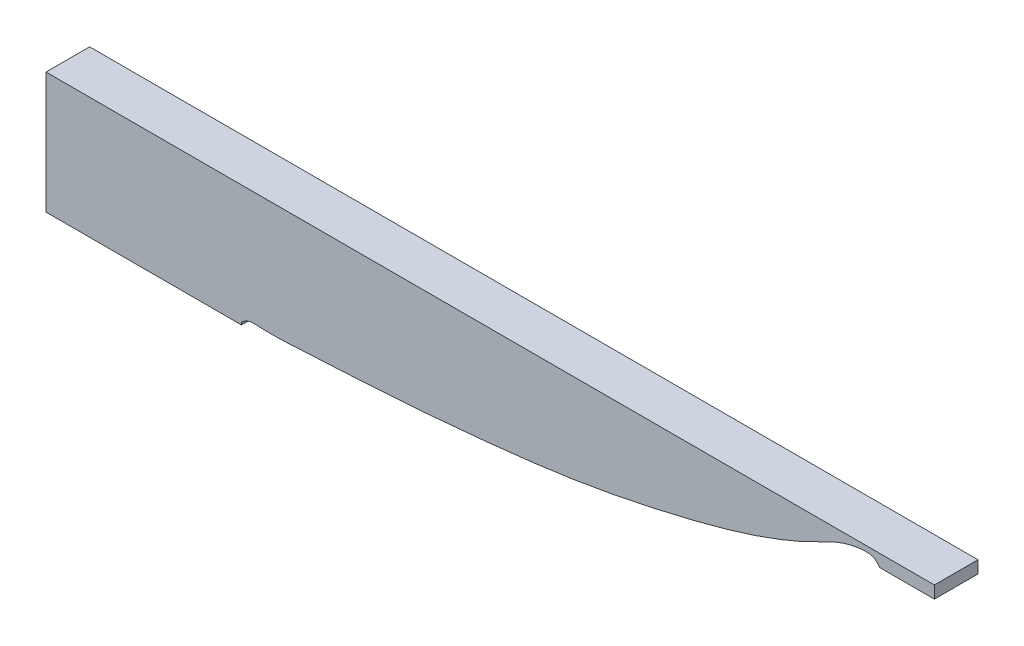
ISO-10303-21;
HEADER;
FILE_DESCRIPTION(('STEP AP214'),'2;1');
FILE_NAME('part.step','',(''),(''),'','','');
FILE_SCHEMA(('AUTOMOTIVE_DESIGN { 1 0 10303 214 1 1 1 1 }'));
ENDSEC;
DATA;
#1=APPLICATION_CONTEXT('core data for automotive mechanical design processes');
#2=APPLICATION_PROTOCOL_DEFINITION('international standard','automotive_design',2000,#1);
#3=PRODUCT_CONTEXT('',#1,'mechanical');
#4=PRODUCT('Part','Part','',(#3));
#5=PRODUCT_RELATED_PRODUCT_CATEGORY('part','',(#4));
#6=PRODUCT_DEFINITION_FORMATION('','',#4);
#7=PRODUCT_DEFINITION_CONTEXT('part definition',#1,'design');
#8=PRODUCT_DEFINITION('design','',#6,#7);
#9=PRODUCT_DEFINITION_SHAPE('','',#8);
#10=(LENGTH_UNIT() NAMED_UNIT(*) SI_UNIT(.MILLI.,.METRE.));
#11=(NAMED_UNIT(*) PLANE_ANGLE_UNIT() SI_UNIT($,.RADIAN.));
#12=(NAMED_UNIT(*) SI_UNIT($,.STERADIAN.) SOLID_ANGLE_UNIT());
#13=UNCERTAINTY_MEASURE_WITH_UNIT(LENGTH_MEASURE(1.E-05),#10,'distance_accuracy_value','');
#14=(GEOMETRIC_REPRESENTATION_CONTEXT(3) GLOBAL_UNCERTAINTY_ASSIGNED_CONTEXT((#13)) GLOBAL_UNIT_ASSIGNED_CONTEXT((#10,
#11,#12)) REPRESENTATION_CONTEXT('',''));
#15=CARTESIAN_POINT('',(0.,0.,0.));
#16=DIRECTION('',(0.,0.,1.));
#17=DIRECTION('',(1.,0.,0.));
#18=AXIS2_PLACEMENT_3D('',#15,#16,#17);
#19=CARTESIAN_POINT('',(-54.9759199936913,-19.9941330622931,404.));
#20=CARTESIAN_POINT('',(-54.988171805809,-19.9156353333143,404.));
#21=CARTESIAN_POINT('',(-54.9989806216152,-19.8353209575329,404.));
#22=CARTESIAN_POINT('',(-54.9862710987579,-19.6757558662551,404.));
#23=CARTESIAN_POINT('',(-54.9629935106463,-19.5967576076714,404.));
#24=CARTESIAN_POINT('',(-54.8838908709714,-19.4582816628676,404.));
#25=CARTESIAN_POINT('',(-54.8254821072894,-19.400730516357,404.));
#26=CARTESIAN_POINT('',(-54.7009742264628,-19.3018176240057,404.));
#27=CARTESIAN_POINT('',(-54.636269424401,-19.2551304164933,404.));
#28=CARTESIAN_POINT('',(-54.4429458905036,-19.1147632315692,404.));
#29=CARTESIAN_POINT('',(-54.3095279622638,-19.0267851507569,404.));
#30=CARTESIAN_POINT('',(-54.0317160052313,-18.8728152328617,404.));
#31=CARTESIAN_POINT('',(-53.8844314835494,-18.8087186106853,404.));
#32=CARTESIAN_POINT('',(-53.4312239278159,-18.6684879778045,404.));
#33=CARTESIAN_POINT('',(-53.121126944279,-18.6351364991182,404.));
#34=CARTESIAN_POINT('',(-52.4953980549397,-18.610255643686,404.));
#35=CARTESIAN_POINT('',(-52.1799457443585,-18.6186677497689,404.));
#36=CARTESIAN_POINT('',(-51.5518140491494,-18.6496583642925,404.));
#37=CARTESIAN_POINT('',(-51.2380182027796,-18.672159866367,404.));
#38=CARTESIAN_POINT('',(-50.6099205721844,-18.7040344150754,404.));
#39=CARTESIAN_POINT('',(-50.2956484293816,-18.7141766196032,404.));
#40=CARTESIAN_POINT('',(-49.3522736609449,-18.7301150068099,404.));
#41=CARTESIAN_POINT('',(-48.7234597310989,-18.7204620753695,404.));
#42=CARTESIAN_POINT('',(-47.4674684558664,-18.6775328700273,404.));
#43=CARTESIAN_POINT('',(-46.8398419678822,-18.6471934282317,404.));
#44=CARTESIAN_POINT('',(-45.5846081557448,-18.5860538211245,404.));
#45=CARTESIAN_POINT('',(-44.9569810767472,-18.5557285880628,404.));
#46=CARTESIAN_POINT('',(-43.0742591285929,-18.460923377232,404.));
#47=CARTESIAN_POINT('',(-41.8193114107406,-18.3927539848054,404.));
#48=CARTESIAN_POINT('',(-35.5447870479957,-18.0493906166732,404.));
#49=CARTESIAN_POINT('',(-30.5250300729805,-17.7700063976011,404.));
#50=CARTESIAN_POINT('',(-23.0033616677377,-17.2389315087065,404.));
#51=CARTESIAN_POINT('',(-20.497863813696,-17.0418865431098,404.));
#52=CARTESIAN_POINT('',(-15.4905554158297,-16.6050011347018,404.));
#53=CARTESIAN_POINT('',(-12.9885647145134,-16.367251626846,404.));
#54=CARTESIAN_POINT('',(-7.98762468754573,-15.8564539475265,404.));
#55=CARTESIAN_POINT('',(-5.48884904194819,-15.585542885072,404.));
#56=CARTESIAN_POINT('',(-0.498150673133531,-14.9921751523398,404.));
#57=CARTESIAN_POINT('',(1.993700739671,-14.6681317561795,404.));
#58=CARTESIAN_POINT('',(6.96627659810819,-13.933009952877,404.));
#59=CARTESIAN_POINT('',(9.44706432617562,-13.520290535103,404.));
#60=CARTESIAN_POINT('',(14.3909921656193,-12.6071522290274,404.));
#61=CARTESIAN_POINT('',(16.8557859179607,-12.1087678314655,404.));
#62=CARTESIAN_POINT('',(21.7700167142596,-11.0511130244635,404.));
#63=CARTESIAN_POINT('',(24.2196285648862,-10.4906239716622,404.));
#64=CARTESIAN_POINT('',(29.1008888018783,-9.2938479979295,404.));
#65=CARTESIAN_POINT('',(31.5340065661712,-8.65923511886526,404.));
#66=CARTESIAN_POINT('',(35.1589895144978,-7.61873956423544,404.));
#67=CARTESIAN_POINT('',(36.3626218461446,-7.25697158666463,404.));
#68=CARTESIAN_POINT('',(38.7574226575233,-6.49378726881297,404.));
#69=CARTESIAN_POINT('',(39.9484055871065,-6.09157300558113,404.));
#70=CARTESIAN_POINT('',(42.3175443267645,-5.24718299840018,404.));
#71=CARTESIAN_POINT('',(43.4945184467857,-4.80654675364475,404.));
#72=CARTESIAN_POINT('',(45.8271291064,-3.87346669012293,404.));
#73=CARTESIAN_POINT('',(46.9825529041748,-3.38050633493232,404.));
#74=CARTESIAN_POINT('',(48.6918329614653,-2.58314438943043,404.));
#75=CARTESIAN_POINT('',(49.2576879546835,-2.30785051063564,404.));
#76=CARTESIAN_POINT('',(50.3851221654167,-1.74709741286748,404.));
#77=CARTESIAN_POINT('',(50.946106345665,-1.46018684918631,404.));
#78=CARTESIAN_POINT('',(52.6324178839811,-0.607486018441772,404.));
#79=CARTESIAN_POINT('',(53.7623053042049,-0.0525981772823966,404.));
#80=CARTESIAN_POINT('',(55.5378614572161,0.586732141010624,404.));
#81=CARTESIAN_POINT('',(56.1438227479313,0.766109167326982,404.));
#82=CARTESIAN_POINT('',(57.075062797956,0.981863254711872,404.));
#83=CARTESIAN_POINT('',(57.3897917543422,1.04521831177245,404.));
#84=CARTESIAN_POINT('',(58.0193822238296,1.15140070610309,404.));
#85=CARTESIAN_POINT('',(58.3350606758036,1.19414728618686,404.));
#86=CARTESIAN_POINT('',(58.9683868825086,1.25657513213641,404.));
#87=CARTESIAN_POINT('',(59.285990656718,1.27677151663812,404.));
#88=CARTESIAN_POINT('',(59.7654389150296,1.27142989903905,404.));
#89=CARTESIAN_POINT('',(59.9258601279714,1.26385446808228,404.));
#90=CARTESIAN_POINT('',(60.2474483042549,1.23469408259294,404.));
#91=CARTESIAN_POINT('',(60.4066673045912,1.21269721407299,404.));
#92=CARTESIAN_POINT('',(60.7194728098012,1.14218153171377,404.));
#93=CARTESIAN_POINT('',(60.8754803126225,1.09208975651278,404.));
#94=CARTESIAN_POINT('',(61.1633078032063,0.948405597768247,404.));
#95=CARTESIAN_POINT('',(61.2921137461695,0.852280799234918,404.));
#96=CARTESIAN_POINT('',(61.5315101507243,0.633666419603811,404.));
#97=CARTESIAN_POINT('',(61.6390151403465,0.512897095989548,404.));
#98=CARTESIAN_POINT('',(61.8056485006105,0.33679666042394,404.));
#99=CARTESIAN_POINT('',(61.8614051579165,0.27829599583071,404.));
#100=CARTESIAN_POINT('',(61.9613148052103,0.150386730309567,404.));
#101=CARTESIAN_POINT('',(62.0027326649078,0.0796805459933336,404.));
#102=CARTESIAN_POINT('',(62.0209520684606,0.,404.));
#103=B_SPLINE_CURVE_WITH_KNOTS('',3,(#19,#20,#21,#22,#23,#24,#25,#26,#27,#28,#29,#30,#31,#32,
#33,#34,#35,#36,#37,#38,#39,#40,#41,#42,#43,#44,#45,#46,#47,#48,#49,#50,#51,#52,#53,#54,#55,#56,
#57,#58,#59,#60,#61,#62,#63,#64,#65,#66,#67,#68,#69,#70,#71,#72,#73,#74,#75,#76,#77,#78,#79,#80,
#81,#82,#83,#84,#85,#86,#87,#88,#89,#90,#91,#92,#93,#94,#95,#96,#97,#98,#99,#100,#101,#102),
.UNSPECIFIED.,.F.,.F.,(4,2,2,2,2,2,2,2,2,2,2,2,2,2,2,2,2,2,2,2,2,2,2,2,2,2,2,2,2,2,2,2,2,2,2,2,
2,2,2,2,2,4),(0.,0.001953125,0.00390625,0.00585937500000011,0.00781250000000011,
0.0117187500000001,0.0156250000000001,0.0234375000000002,0.0312500000000003,0.0390625000000004,
0.0468750000000004,0.0625000000000004,0.0781250000000003,0.0937500000000002,0.125,0.25,0.3125,
0.375,0.4375,0.5,0.5625,0.625,0.6875,0.75,0.78125,0.8125,0.84375,0.875,0.890625,0.90625,0.9375,
0.953125,0.9609375,0.96875,0.9765625,0.98046875,0.984375,0.98828125,0.9921875,0.99609375,
0.998046875,1.),.UNSPECIFIED.);
#104=DIRECTION('',(0.,0.,-1.));
#105=VECTOR('',#104,1.);
#106=SURFACE_OF_LINEAR_EXTRUSION('',#103,#105);
#107=CARTESIAN_POINT('',(-54.9759199936913,-19.9941330622931,396.));
#108=CARTESIAN_POINT('',(-54.988171805809,-19.9156353333143,396.));
#109=CARTESIAN_POINT('',(-54.9989806216152,-19.8353209575329,396.));
#110=CARTESIAN_POINT('',(-54.9862710987579,-19.6757558662551,396.));
#111=CARTESIAN_POINT('',(-54.9629935106463,-19.5967576076714,396.));
#112=CARTESIAN_POINT('',(-54.8838908709714,-19.4582816628676,396.));
#113=CARTESIAN_POINT('',(-54.8254821072894,-19.400730516357,396.));
#114=CARTESIAN_POINT('',(-54.7009742264628,-19.3018176240057,396.));
#115=CARTESIAN_POINT('',(-54.636269424401,-19.2551304164933,396.));
#116=CARTESIAN_POINT('',(-54.4429458905036,-19.1147632315692,396.));
#117=CARTESIAN_POINT('',(-54.3095279622638,-19.0267851507569,396.));
#118=CARTESIAN_POINT('',(-54.0317160052313,-18.8728152328617,396.));
#119=CARTESIAN_POINT('',(-53.8844314835494,-18.8087186106853,396.));
#120=CARTESIAN_POINT('',(-53.4312239278159,-18.6684879778045,396.));
#121=CARTESIAN_POINT('',(-53.121126944279,-18.6351364991182,396.));
#122=CARTESIAN_POINT('',(-52.4953980549397,-18.610255643686,396.));
#123=CARTESIAN_POINT('',(-52.1799457443585,-18.6186677497689,396.));
#124=CARTESIAN_POINT('',(-51.5518140491494,-18.6496583642925,396.));
#125=CARTESIAN_POINT('',(-51.2380182027796,-18.672159866367,396.));
#126=CARTESIAN_POINT('',(-50.6099205721844,-18.7040344150754,396.));
#127=CARTESIAN_POINT('',(-50.2956484293816,-18.7141766196032,396.));
#128=CARTESIAN_POINT('',(-49.3522736609449,-18.7301150068099,396.));
#129=CARTESIAN_POINT('',(-48.7234597310989,-18.7204620753695,396.));
#130=CARTESIAN_POINT('',(-47.4674684558664,-18.6775328700273,396.));
#131=CARTESIAN_POINT('',(-46.8398419678822,-18.6471934282317,396.));
#132=CARTESIAN_POINT('',(-45.5846081557448,-18.5860538211245,396.));
#133=CARTESIAN_POINT('',(-44.9569810767472,-18.5557285880628,396.));
#134=CARTESIAN_POINT('',(-43.0742591285929,-18.460923377232,396.));
#135=CARTESIAN_POINT('',(-41.8193114107406,-18.3927539848054,396.));
#136=CARTESIAN_POINT('',(-35.5447870479957,-18.0493906166732,396.));
#137=CARTESIAN_POINT('',(-30.5250300729805,-17.7700063976011,396.));
#138=CARTESIAN_POINT('',(-23.0033616677377,-17.2389315087065,396.));
#139=CARTESIAN_POINT('',(-20.497863813696,-17.0418865431098,396.));
#140=CARTESIAN_POINT('',(-15.4905554158297,-16.6050011347018,396.));
#141=CARTESIAN_POINT('',(-12.9885647145134,-16.367251626846,396.));
#142=CARTESIAN_POINT('',(-7.98762468754573,-15.8564539475265,396.));
#143=CARTESIAN_POINT('',(-5.48884904194819,-15.585542885072,396.));
#144=CARTESIAN_POINT('',(-0.498150673133531,-14.9921751523398,396.));
#145=CARTESIAN_POINT('',(1.993700739671,-14.6681317561795,396.));
#146=CARTESIAN_POINT('',(6.96627659810819,-13.933009952877,396.));
#147=CARTESIAN_POINT('',(9.44706432617562,-13.520290535103,396.));
#148=CARTESIAN_POINT('',(14.3909921656193,-12.6071522290274,396.));
#149=CARTESIAN_POINT('',(16.8557859179607,-12.1087678314655,396.));
#150=CARTESIAN_POINT('',(21.7700167142596,-11.0511130244635,396.));
#151=CARTESIAN_POINT('',(24.2196285648862,-10.4906239716622,396.));
#152=CARTESIAN_POINT('',(29.1008888018783,-9.2938479979295,396.));
#153=CARTESIAN_POINT('',(31.5340065661712,-8.65923511886526,396.));
#154=CARTESIAN_POINT('',(35.1589895144978,-7.61873956423544,396.));
#155=CARTESIAN_POINT('',(36.3626218461446,-7.25697158666463,396.));
#156=CARTESIAN_POINT('',(38.7574226575233,-6.49378726881297,396.));
#157=CARTESIAN_POINT('',(39.9484055871065,-6.09157300558113,396.));
#158=CARTESIAN_POINT('',(42.3175443267645,-5.24718299840018,396.));
#159=CARTESIAN_POINT('',(43.4945184467857,-4.80654675364475,396.));
#160=CARTESIAN_POINT('',(45.8271291064,-3.87346669012293,396.));
#161=CARTESIAN_POINT('',(46.9825529041748,-3.38050633493232,396.));
#162=CARTESIAN_POINT('',(48.6918329614653,-2.58314438943043,396.));
#163=CARTESIAN_POINT('',(49.2576879546835,-2.30785051063564,396.));
#164=CARTESIAN_POINT('',(50.3851221654167,-1.74709741286748,396.));
#165=CARTESIAN_POINT('',(50.946106345665,-1.46018684918631,396.));
#166=CARTESIAN_POINT('',(52.6324178839811,-0.607486018441772,396.));
#167=CARTESIAN_POINT('',(53.7623053042049,-0.0525981772823966,396.));
#168=CARTESIAN_POINT('',(55.5378614572161,0.586732141010624,396.));
#169=CARTESIAN_POINT('',(56.1438227479313,0.766109167326982,396.));
#170=CARTESIAN_POINT('',(57.075062797956,0.981863254711872,396.));
#171=CARTESIAN_POINT('',(57.3897917543422,1.04521831177245,396.));
#172=CARTESIAN_POINT('',(58.0193822238296,1.15140070610309,396.));
#173=CARTESIAN_POINT('',(58.3350606758036,1.19414728618686,396.));
#174=CARTESIAN_POINT('',(58.9683868825086,1.25657513213641,396.));
#175=CARTESIAN_POINT('',(59.285990656718,1.27677151663812,396.));
#176=CARTESIAN_POINT('',(59.7654389150296,1.27142989903905,396.));
#177=CARTESIAN_POINT('',(59.9258601279714,1.26385446808228,396.));
#178=CARTESIAN_POINT('',(60.2474483042549,1.23469408259294,396.));
#179=CARTESIAN_POINT('',(60.4066673045912,1.21269721407299,396.));
#180=CARTESIAN_POINT('',(60.7194728098012,1.14218153171377,396.));
#181=CARTESIAN_POINT('',(60.8754803126225,1.09208975651278,396.));
#182=CARTESIAN_POINT('',(61.1633078032063,0.948405597768247,396.));
#183=CARTESIAN_POINT('',(61.2921137461695,0.852280799234918,396.));
#184=CARTESIAN_POINT('',(61.5315101507243,0.633666419603811,396.));
#185=CARTESIAN_POINT('',(61.6390151403465,0.512897095989548,396.));
#186=CARTESIAN_POINT('',(61.8056485006105,0.33679666042394,396.));
#187=CARTESIAN_POINT('',(61.8614051579165,0.27829599583071,396.));
#188=CARTESIAN_POINT('',(61.9613148052103,0.150386730309567,396.));
#189=CARTESIAN_POINT('',(62.0027326649078,0.0796805459933336,396.));
#190=CARTESIAN_POINT('',(62.0209520684606,0.,396.));
#191=B_SPLINE_CURVE_WITH_KNOTS('',3,(#107,#108,#109,#110,#111,#112,#113,#114,#115,#116,#117,
#118,#119,#120,#121,#122,#123,#124,#125,#126,#127,#128,#129,#130,#131,#132,#133,#134,#135,#136,
#137,#138,#139,#140,#141,#142,#143,#144,#145,#146,#147,#148,#149,#150,#151,#152,#153,#154,#155,
#156,#157,#158,#159,#160,#161,#162,#163,#164,#165,#166,#167,#168,#169,#170,#171,#172,#173,#174,
#175,#176,#177,#178,#179,#180,#181,#182,#183,#184,#185,#186,#187,#188,#189,#190),.UNSPECIFIED.,
.F.,.F.,(4,2,2,2,2,2,2,2,2,2,2,2,2,2,2,2,2,2,2,2,2,2,2,2,2,2,2,2,2,2,2,2,2,2,2,2,2,2,2,2,2,4),
(0.,0.001953125,0.00390625,0.00585937500000011,0.00781250000000011,0.0117187500000001,
0.0156250000000001,0.0234375000000002,0.0312500000000003,0.0390625000000004,0.0468750000000004,
0.0625000000000004,0.0781250000000003,0.0937500000000002,0.125,0.25,0.3125,0.375,0.4375,0.5,
0.5625,0.625,0.6875,0.75,0.78125,0.8125,0.84375,0.875,0.890625,0.90625,0.9375,0.953125,
0.9609375,0.96875,0.9765625,0.98046875,0.984375,0.98828125,0.9921875,0.99609375,0.998046875,1.),.UNSPECIFIED.);
#192=CARTESIAN_POINT('',(-54.975919993689,-19.9941330622879,396.));
#193=VERTEX_POINT('',#192);
#194=CARTESIAN_POINT('',(62.0209520684605,1.91202441249608E-13,396.));
#195=VERTEX_POINT('',#194);
#196=EDGE_CURVE('E208',#193,#195,#191,.T.);
#197=ORIENTED_EDGE('',*,*,#196,.T.);
#198=DIRECTION('',(0.,0.,-1.));
#199=VECTOR('',#198,1.);
#200=CARTESIAN_POINT('',(62.0209520684605,1.91202441249608E-13,404.));
#201=LINE('',#200,#199);
#202=CARTESIAN_POINT('',(62.0209520684605,1.91202441249608E-13,404.));
#203=VERTEX_POINT('',#202);
#204=EDGE_CURVE('E11',#203,#195,#201,.T.);
#205=ORIENTED_EDGE('',*,*,#204,.F.);
#206=CARTESIAN_POINT('',(62.0209520684606,0.,404.));
#207=CARTESIAN_POINT('',(62.0027326649078,0.0796805459933336,404.));
#208=CARTESIAN_POINT('',(61.9613148052103,0.150386730309567,404.));
#209=CARTESIAN_POINT('',(61.8614051579165,0.27829599583071,404.));
#210=CARTESIAN_POINT('',(61.8056485006105,0.33679666042394,404.));
#211=CARTESIAN_POINT('',(61.6390151403465,0.512897095989548,404.));
#212=CARTESIAN_POINT('',(61.5315101507243,0.633666419603811,404.));
#213=CARTESIAN_POINT('',(61.2921137461695,0.852280799234918,404.));
#214=CARTESIAN_POINT('',(61.1633078032063,0.948405597768247,404.));
#215=CARTESIAN_POINT('',(60.8754803126225,1.09208975651278,404.));
#216=CARTESIAN_POINT('',(60.7194728098012,1.14218153171377,404.));
#217=CARTESIAN_POINT('',(60.4066673045912,1.21269721407299,404.));
#218=CARTESIAN_POINT('',(60.2474483042549,1.23469408259294,404.));
#219=CARTESIAN_POINT('',(59.9258601279714,1.26385446808228,404.));
#220=CARTESIAN_POINT('',(59.7654389150296,1.27142989903905,404.));
#221=CARTESIAN_POINT('',(59.285990656718,1.27677151663812,404.));
#222=CARTESIAN_POINT('',(58.9683868825086,1.25657513213641,404.));
#223=CARTESIAN_POINT('',(58.3350606758036,1.19414728618686,404.));
#224=CARTESIAN_POINT('',(58.0193822238296,1.15140070610309,404.));
#225=CARTESIAN_POINT('',(57.3897917543422,1.04521831177245,404.));
#226=CARTESIAN_POINT('',(57.075062797956,0.981863254711872,404.));
#227=CARTESIAN_POINT('',(56.1438227479313,0.766109167326982,404.));
#228=CARTESIAN_POINT('',(55.5378614572161,0.586732141010624,404.));
#229=CARTESIAN_POINT('',(53.7623053042049,-0.0525981772823966,404.));
#230=CARTESIAN_POINT('',(52.6324178839811,-0.607486018441772,404.));
#231=CARTESIAN_POINT('',(50.946106345665,-1.46018684918631,404.));
#232=CARTESIAN_POINT('',(50.3851221654167,-1.74709741286748,404.));
#233=CARTESIAN_POINT('',(49.2576879546835,-2.30785051063564,404.));
#234=CARTESIAN_POINT('',(48.6918329614653,-2.58314438943043,404.));
#235=CARTESIAN_POINT('',(46.9825529041748,-3.38050633493232,404.));
#236=CARTESIAN_POINT('',(45.8271291064,-3.87346669012293,404.));
#237=CARTESIAN_POINT('',(43.4945184467857,-4.80654675364475,404.));
#238=CARTESIAN_POINT('',(42.3175443267645,-5.24718299840018,404.));
#239=CARTESIAN_POINT('',(39.9484055871065,-6.09157300558113,404.));
#240=CARTESIAN_POINT('',(38.7574226575233,-6.49378726881297,404.));
#241=CARTESIAN_POINT('',(36.3626218461446,-7.25697158666463,404.));
#242=CARTESIAN_POINT('',(35.1589895144978,-7.61873956423544,404.));
#243=CARTESIAN_POINT('',(31.5340065661712,-8.65923511886526,404.));
#244=CARTESIAN_POINT('',(29.1008888018783,-9.2938479979295,404.));
#245=CARTESIAN_POINT('',(24.2196285648862,-10.4906239716622,404.));
#246=CARTESIAN_POINT('',(21.7700167142596,-11.0511130244635,404.));
#247=CARTESIAN_POINT('',(16.8557859179607,-12.1087678314655,404.));
#248=CARTESIAN_POINT('',(14.3909921656193,-12.6071522290274,404.));
#249=CARTESIAN_POINT('',(9.44706432617562,-13.520290535103,404.));
#250=CARTESIAN_POINT('',(6.96627659810819,-13.933009952877,404.));
#251=CARTESIAN_POINT('',(1.993700739671,-14.6681317561795,404.));
#252=CARTESIAN_POINT('',(-0.498150673133531,-14.9921751523398,404.));
#253=CARTESIAN_POINT('',(-5.48884904194819,-15.585542885072,404.));
#254=CARTESIAN_POINT('',(-7.98762468754573,-15.8564539475265,404.));
#255=CARTESIAN_POINT('',(-12.9885647145134,-16.367251626846,404.));
#256=CARTESIAN_POINT('',(-15.4905554158297,-16.6050011347018,404.));
#257=CARTESIAN_POINT('',(-20.497863813696,-17.0418865431098,404.));
#258=CARTESIAN_POINT('',(-23.0033616677377,-17.2389315087065,404.));
#259=CARTESIAN_POINT('',(-30.5250300729805,-17.7700063976011,404.));
#260=CARTESIAN_POINT('',(-35.5447870479957,-18.0493906166732,404.));
#261=CARTESIAN_POINT('',(-41.8193114107406,-18.3927539848054,404.));
#262=CARTESIAN_POINT('',(-43.0742591285929,-18.460923377232,404.));
#263=CARTESIAN_POINT('',(-44.9569810767472,-18.5557285880628,404.));
#264=CARTESIAN_POINT('',(-45.5846081557448,-18.5860538211245,404.));
#265=CARTESIAN_POINT('',(-46.8398419678822,-18.6471934282317,404.));
#266=CARTESIAN_POINT('',(-47.4674684558664,-18.6775328700273,404.));
#267=CARTESIAN_POINT('',(-48.7234597310989,-18.7204620753695,404.));
#268=CARTESIAN_POINT('',(-49.3522736609449,-18.7301150068099,404.));
#269=CARTESIAN_POINT('',(-50.2956484293816,-18.7141766196032,404.));
#270=CARTESIAN_POINT('',(-50.6099205721844,-18.7040344150754,404.));
#271=CARTESIAN_POINT('',(-51.2380182027796,-18.672159866367,404.));
#272=CARTESIAN_POINT('',(-51.5518140491494,-18.6496583642925,404.));
#273=CARTESIAN_POINT('',(-52.1799457443585,-18.6186677497689,404.));
#274=CARTESIAN_POINT('',(-52.4953980549397,-18.610255643686,404.));
#275=CARTESIAN_POINT('',(-53.121126944279,-18.6351364991182,404.));
#276=CARTESIAN_POINT('',(-53.4312239278159,-18.6684879778045,404.));
#277=CARTESIAN_POINT('',(-53.8844314835494,-18.8087186106853,404.));
#278=CARTESIAN_POINT('',(-54.0317160052313,-18.8728152328617,404.));
#279=CARTESIAN_POINT('',(-54.3095279622638,-19.0267851507569,404.));
#280=CARTESIAN_POINT('',(-54.4429458905036,-19.1147632315692,404.));
#281=CARTESIAN_POINT('',(-54.636269424401,-19.2551304164933,404.));
#282=CARTESIAN_POINT('',(-54.7009742264628,-19.3018176240057,404.));
#283=CARTESIAN_POINT('',(-54.8254821072894,-19.400730516357,404.));
#284=CARTESIAN_POINT('',(-54.8838908709714,-19.4582816628676,404.));
#285=CARTESIAN_POINT('',(-54.9629935106463,-19.5967576076714,404.));
#286=CARTESIAN_POINT('',(-54.9862710987579,-19.6757558662551,404.));
#287=CARTESIAN_POINT('',(-54.9989806216152,-19.8353209575329,404.));
#288=CARTESIAN_POINT('',(-54.988171805809,-19.9156353333143,404.));
#289=CARTESIAN_POINT('',(-54.9759199936913,-19.9941330622931,404.));
#290=B_SPLINE_CURVE_WITH_KNOTS('',3,(#206,#207,#208,#209,#210,#211,#212,#213,#214,#215,#216,
#217,#218,#219,#220,#221,#222,#223,#224,#225,#226,#227,#228,#229,#230,#231,#232,#233,#234,#235,
#236,#237,#238,#239,#240,#241,#242,#243,#244,#245,#246,#247,#248,#249,#250,#251,#252,#253,#254,
#255,#256,#257,#258,#259,#260,#261,#262,#263,#264,#265,#266,#267,#268,#269,#270,#271,#272,#273,
#274,#275,#276,#277,#278,#279,#280,#281,#282,#283,#284,#285,#286,#287,#288,#289),.UNSPECIFIED.,
.F.,.F.,(4,2,2,2,2,2,2,2,2,2,2,2,2,2,2,2,2,2,2,2,2,2,2,2,2,2,2,2,2,2,2,2,2,2,2,2,2,2,2,2,2,4),
(0.,0.001953125,0.00390625,0.00781250000000011,0.0117187500000001,0.0156250000000001,
0.0195312500000002,0.0234375000000002,0.0312500000000003,0.0390625000000004,0.0468750000000004,
0.0625000000000004,0.0937500000000004,0.109375,0.125,0.15625,0.1875,0.21875,0.25,0.3125,0.375,
0.4375,0.5,0.5625,0.625,0.6875,0.75,0.875,0.90625,0.921875,0.9375,0.953125,0.9609375,0.96875,
0.9765625,0.984375,0.98828125,0.9921875,0.994140625,0.99609375,0.998046875,1.),.UNSPECIFIED.);
#291=CARTESIAN_POINT('',(-54.975919993689,-19.9941330622879,404.));
#292=VERTEX_POINT('',#291);
#293=EDGE_CURVE('E191',#292,#203,#290,.F.);
#294=ORIENTED_EDGE('',*,*,#293,.F.);
#295=DIRECTION('',(0.,0.,-1.));
#296=VECTOR('',#295,1.);
#297=CARTESIAN_POINT('',(-54.975919993689,-19.9941330622879,404.));
#298=LINE('',#297,#296);
#299=EDGE_CURVE('E116',#292,#193,#298,.T.);
#300=ORIENTED_EDGE('',*,*,#299,.T.);
#301=EDGE_LOOP('',(#197,#205,#294,#300));
#302=FACE_BOUND('',#301,.T.);
#303=ADVANCED_FACE('F30',(#302),#106,.F.);
#304=CARTESIAN_POINT('',(62.0209520684605,1.91202441249608E-13,404.));
#305=DIRECTION('',(0.,1.,0.));
#306=DIRECTION('',(-1.,0.,0.));
#307=AXIS2_PLACEMENT_3D('',#304,#305,#306);
#308=PLANE('',#307);
#309=DIRECTION('',(1.,0.,0.));
#310=VECTOR('',#309,1.);
#311=CARTESIAN_POINT('',(62.0209520684605,1.91202441249608E-13,396.));
#312=LINE('',#311,#310);
#313=CARTESIAN_POINT('',(72.1082204239684,0.,396.));
#314=VERTEX_POINT('',#313);
#315=EDGE_CURVE('E161',#195,#314,#312,.T.);
#316=ORIENTED_EDGE('',*,*,#315,.T.);
#317=DIRECTION('',(0.,0.,-1.));
#318=VECTOR('',#317,1.);
#319=CARTESIAN_POINT('',(72.1082204239684,0.,404.));
#320=LINE('',#319,#318);
#321=CARTESIAN_POINT('',(72.1082204239684,0.,404.));
#322=VERTEX_POINT('',#321);
#323=EDGE_CURVE('E41',#322,#314,#320,.T.);
#324=ORIENTED_EDGE('',*,*,#323,.F.);
#325=DIRECTION('',(1.,0.,0.));
#326=VECTOR('',#325,1.);
#327=CARTESIAN_POINT('',(62.0209520684605,1.91202441249608E-13,404.));
#328=LINE('',#327,#326);
#329=EDGE_CURVE('E89',#203,#322,#328,.T.);
#330=ORIENTED_EDGE('',*,*,#329,.F.);
#331=ORIENTED_EDGE('',*,*,#204,.T.);
#332=EDGE_LOOP('',(#316,#324,#330,#331));
#333=FACE_BOUND('',#332,.T.);
#334=ADVANCED_FACE('F226',(#333),#308,.F.);
#335=CARTESIAN_POINT('',(72.1082204239684,2.25600000000005,404.));
#336=DIRECTION('',(-1.,0.,0.));
#337=DIRECTION('',(0.,0.,1.));
#338=AXIS2_PLACEMENT_3D('',#335,#336,#337);
#339=PLANE('',#338);
#340=DIRECTION('',(0.,1.,0.));
#341=VECTOR('',#340,1.);
#342=CARTESIAN_POINT('',(72.1082204239684,2.25600000000005,396.));
#343=LINE('',#342,#341);
#344=CARTESIAN_POINT('',(72.1082204239684,2.25600000000005,396.));
#345=VERTEX_POINT('',#344);
#346=EDGE_CURVE('E156',#314,#345,#343,.T.);
#347=ORIENTED_EDGE('',*,*,#346,.T.);
#348=DIRECTION('',(0.,0.,-1.));
#349=VECTOR('',#348,1.);
#350=CARTESIAN_POINT('',(72.1082204239684,2.25600000000005,404.));
#351=LINE('',#350,#349);
#352=CARTESIAN_POINT('',(72.1082204239684,2.25600000000005,404.));
#353=VERTEX_POINT('',#352);
#354=EDGE_CURVE('E111',#353,#345,#351,.T.);
#355=ORIENTED_EDGE('',*,*,#354,.F.);
#356=DIRECTION('',(0.,1.,0.));
#357=VECTOR('',#356,1.);
#358=CARTESIAN_POINT('',(72.1082204239684,2.25600000000005,404.));
#359=LINE('',#358,#357);
#360=EDGE_CURVE('E102',#322,#353,#359,.T.);
#361=ORIENTED_EDGE('',*,*,#360,.F.);
#362=ORIENTED_EDGE('',*,*,#323,.T.);
#363=EDGE_LOOP('',(#347,#355,#361,#362));
#364=FACE_BOUND('',#363,.T.);
#365=ADVANCED_FACE('F229',(#364),#339,.F.);
#366=CARTESIAN_POINT('',(72.1082204239684,2.25600000000005,404.));
#367=DIRECTION('',(0.,-1.,0.));
#368=DIRECTION('',(1.,0.,0.));
#369=AXIS2_PLACEMENT_3D('',#366,#367,#368);
#370=PLANE('',#369);
#371=DIRECTION('',(-1.,0.,0.));
#372=VECTOR('',#371,1.);
#373=CARTESIAN_POINT('',(72.1082204239684,2.25600000000005,396.));
#374=LINE('',#373,#372);
#375=CARTESIAN_POINT('',(-90.8238448185953,2.25600000000003,396.));
#376=VERTEX_POINT('',#375);
#377=EDGE_CURVE('E110',#345,#376,#374,.T.);
#378=ORIENTED_EDGE('',*,*,#377,.T.);
#379=DIRECTION('',(0.,0.,-1.));
#380=VECTOR('',#379,1.);
#381=CARTESIAN_POINT('',(-90.8238448185953,2.25600000000003,404.));
#382=LINE('',#381,#380);
#383=CARTESIAN_POINT('',(-90.8238448185953,2.25600000000003,404.));
#384=VERTEX_POINT('',#383);
#385=EDGE_CURVE('E107',#384,#376,#382,.T.);
#386=ORIENTED_EDGE('',*,*,#385,.F.);
#387=DIRECTION('',(-1.,0.,0.));
#388=VECTOR('',#387,1.);
#389=CARTESIAN_POINT('',(72.1082204239684,2.25600000000005,404.));
#390=LINE('',#389,#388);
#391=EDGE_CURVE('E96',#353,#384,#390,.T.);
#392=ORIENTED_EDGE('',*,*,#391,.F.);
#393=ORIENTED_EDGE('',*,*,#354,.T.);
#394=EDGE_LOOP('',(#378,#386,#392,#393));
#395=FACE_BOUND('',#394,.T.);
#396=ADVANCED_FACE('F108',(#395),#370,.F.);
#397=CARTESIAN_POINT('',(-90.8238448185953,-19.9943761586844,404.));
#398=DIRECTION('',(1.,0.,0.));
#399=DIRECTION('',(0.,0.,-1.));
#400=AXIS2_PLACEMENT_3D('',#397,#398,#399);
#401=PLANE('',#400);
#402=DIRECTION('',(0.,-1.,0.));
#403=VECTOR('',#402,1.);
#404=CARTESIAN_POINT('',(-90.8238448185953,-19.9943761586844,396.));
#405=LINE('',#404,#403);
#406=CARTESIAN_POINT('',(-90.8238448185953,-19.9943761586844,396.));
#407=VERTEX_POINT('',#406);
#408=EDGE_CURVE('E74',#376,#407,#405,.T.);
#409=ORIENTED_EDGE('',*,*,#408,.T.);
#410=DIRECTION('',(0.,0.,-1.));
#411=VECTOR('',#410,1.);
#412=CARTESIAN_POINT('',(-90.8238448185953,-19.9943761586844,404.));
#413=LINE('',#412,#411);
#414=CARTESIAN_POINT('',(-90.8238448185953,-19.9943761586844,404.));
#415=VERTEX_POINT('',#414);
#416=EDGE_CURVE('E112',#415,#407,#413,.T.);
#417=ORIENTED_EDGE('',*,*,#416,.F.);
#418=DIRECTION('',(0.,-1.,0.));
#419=VECTOR('',#418,1.);
#420=CARTESIAN_POINT('',(-90.8238448185953,-19.9943761586844,404.));
#421=LINE('',#420,#419);
#422=EDGE_CURVE('E100',#384,#415,#421,.T.);
#423=ORIENTED_EDGE('',*,*,#422,.F.);
#424=ORIENTED_EDGE('',*,*,#385,.T.);
#425=EDGE_LOOP('',(#409,#417,#423,#424));
#426=FACE_BOUND('',#425,.T.);
#427=ADVANCED_FACE('F114',(#426),#401,.F.);
#428=CARTESIAN_POINT('',(-90.8238448185953,-19.9943761586844,404.));
#429=CARTESIAN_POINT('',(-78.8745365435165,-19.9943134095506,404.));
#430=CARTESIAN_POINT('',(-66.9252282685117,-19.9942333493749,404.));
#431=CARTESIAN_POINT('',(-54.975919993689,-19.9941330622879,404.));
#432=B_SPLINE_CURVE_WITH_KNOTS('',3,(#428,#429,#430,#431),.UNSPECIFIED.,.F.,.F.,(4,4),(0.,1.),.UNSPECIFIED.);
#433=DIRECTION('',(0.,0.,-1.));
#434=VECTOR('',#433,1.);
#435=SURFACE_OF_LINEAR_EXTRUSION('',#432,#434);
#436=CARTESIAN_POINT('',(-90.8238448185953,-19.9943761586844,396.));
#437=CARTESIAN_POINT('',(-78.8745365435165,-19.9943134095506,396.));
#438=CARTESIAN_POINT('',(-66.9252282685117,-19.9942333493749,396.));
#439=CARTESIAN_POINT('',(-54.975919993689,-19.9941330622879,396.));
#440=B_SPLINE_CURVE_WITH_KNOTS('',3,(#436,#437,#438,#439),.UNSPECIFIED.,.F.,.F.,(4,4),(0.,1.),.UNSPECIFIED.);
#441=EDGE_CURVE('E80',#407,#193,#440,.T.);
#442=ORIENTED_EDGE('',*,*,#441,.T.);
#443=ORIENTED_EDGE('',*,*,#299,.F.);
#444=CARTESIAN_POINT('',(-54.975919993689,-19.9941330622879,404.));
#445=CARTESIAN_POINT('',(-66.9252282685117,-19.9942333493749,404.));
#446=CARTESIAN_POINT('',(-78.8745365435165,-19.9943134095506,404.));
#447=CARTESIAN_POINT('',(-90.8238448185953,-19.9943761586844,404.));
#448=B_SPLINE_CURVE_WITH_KNOTS('',3,(#444,#445,#446,#447),.UNSPECIFIED.,.F.,.F.,(4,4),(0.,1.),.UNSPECIFIED.);
#449=EDGE_CURVE('E50',#415,#292,#448,.F.);
#450=ORIENTED_EDGE('',*,*,#449,.F.);
#451=ORIENTED_EDGE('',*,*,#416,.T.);
#452=EDGE_LOOP('',(#442,#443,#450,#451));
#453=FACE_BOUND('',#452,.T.);
#454=ADVANCED_FACE('F135',(#453),#435,.F.);
#455=CARTESIAN_POINT('',(4.47998866888962,-14.3005708545282,404.));
#456=DIRECTION('',(0.,0.,-1.));
#457=DIRECTION('',(-1.,0.,0.));
#458=AXIS2_PLACEMENT_3D('',#455,#456,#457);
#459=PLANE('',#458);
#460=ORIENTED_EDGE('',*,*,#293,.T.);
#461=ORIENTED_EDGE('',*,*,#329,.T.);
#462=ORIENTED_EDGE('',*,*,#360,.T.);
#463=ORIENTED_EDGE('',*,*,#391,.T.);
#464=ORIENTED_EDGE('',*,*,#422,.T.);
#465=ORIENTED_EDGE('',*,*,#449,.T.);
#466=EDGE_LOOP('',(#460,#461,#462,#463,#464,#465));
#467=FACE_BOUND('',#466,.T.);
#468=ADVANCED_FACE('F98',(#467),#459,.F.);
#469=CARTESIAN_POINT('',(4.47998866888962,-14.3005708545282,396.));
#470=DIRECTION('',(0.,0.,-1.));
#471=DIRECTION('',(-1.,0.,0.));
#472=AXIS2_PLACEMENT_3D('',#469,#470,#471);
#473=PLANE('',#472);
#474=ORIENTED_EDGE('',*,*,#196,.F.);
#475=ORIENTED_EDGE('',*,*,#441,.F.);
#476=ORIENTED_EDGE('',*,*,#408,.F.);
#477=ORIENTED_EDGE('',*,*,#377,.F.);
#478=ORIENTED_EDGE('',*,*,#346,.F.);
#479=ORIENTED_EDGE('',*,*,#315,.F.);
#480=EDGE_LOOP('',(#474,#475,#476,#477,#478,#479));
#481=FACE_BOUND('',#480,.T.);
#482=ADVANCED_FACE('F146',(#481),#473,.T.);
#483=CLOSED_SHELL('',(#303,#334,#365,#396,#427,#454,#468,#482));
#484=MANIFOLD_SOLID_BREP('B2',#483);
#485=ADVANCED_BREP_SHAPE_REPRESENTATION('',(#18,#484),#14);
#486=SHAPE_DEFINITION_REPRESENTATION(#9,#485);
ENDSEC;
END-ISO-10303-21;
